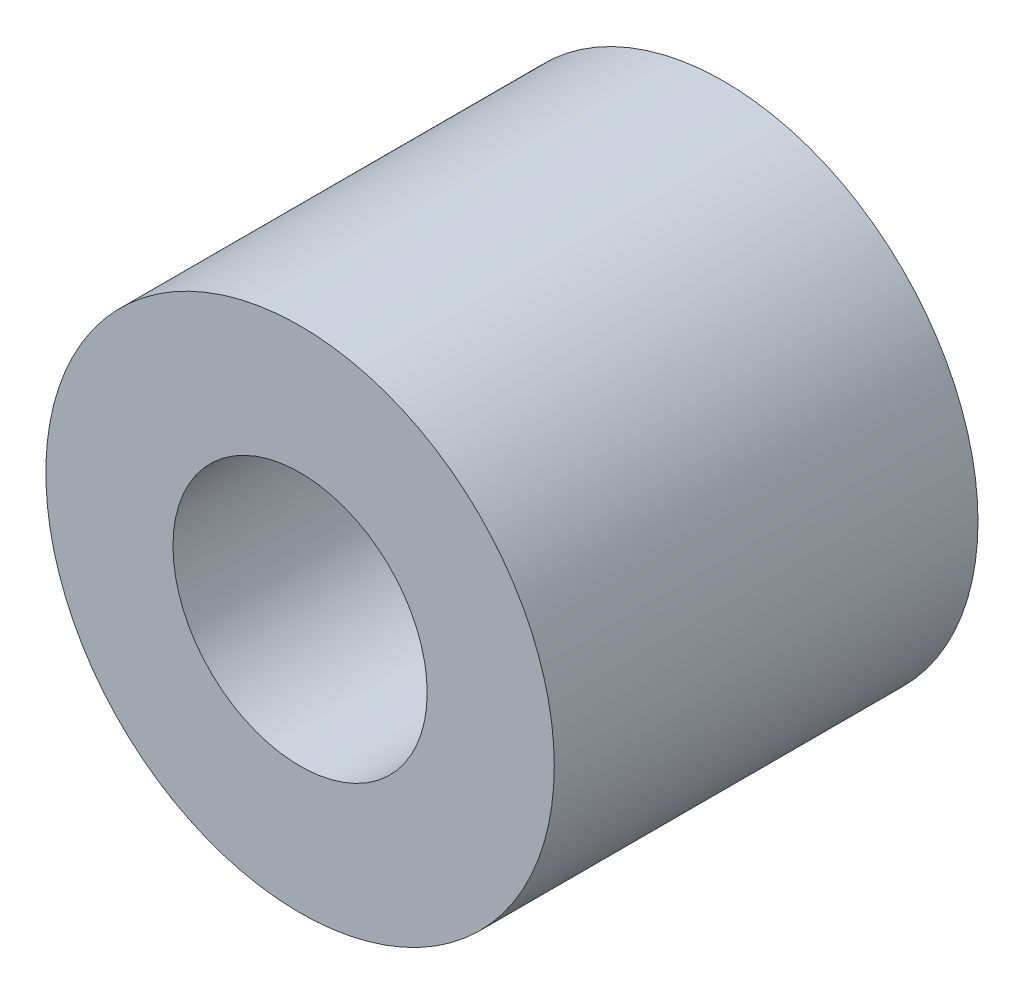
ISO-10303-21;
HEADER;
FILE_DESCRIPTION(('STEP AP214'),'2;1');
FILE_NAME('part.step','',(''),(''),'','','');
FILE_SCHEMA(('AUTOMOTIVE_DESIGN { 1 0 10303 214 1 1 1 1 }'));
ENDSEC;
DATA;
#1=APPLICATION_CONTEXT('core data for automotive mechanical design processes');
#2=APPLICATION_PROTOCOL_DEFINITION('international standard','automotive_design',2000,#1);
#3=PRODUCT_CONTEXT('',#1,'mechanical');
#4=PRODUCT('Part','Part','',(#3));
#5=PRODUCT_RELATED_PRODUCT_CATEGORY('part','',(#4));
#6=PRODUCT_DEFINITION_FORMATION('','',#4);
#7=PRODUCT_DEFINITION_CONTEXT('part definition',#1,'design');
#8=PRODUCT_DEFINITION('design','',#6,#7);
#9=PRODUCT_DEFINITION_SHAPE('','',#8);
#10=(LENGTH_UNIT() NAMED_UNIT(*) SI_UNIT(.MILLI.,.METRE.));
#11=(NAMED_UNIT(*) PLANE_ANGLE_UNIT() SI_UNIT($,.RADIAN.));
#12=(NAMED_UNIT(*) SI_UNIT($,.STERADIAN.) SOLID_ANGLE_UNIT());
#13=UNCERTAINTY_MEASURE_WITH_UNIT(LENGTH_MEASURE(1.E-05),#10,'distance_accuracy_value','');
#14=(GEOMETRIC_REPRESENTATION_CONTEXT(3) GLOBAL_UNCERTAINTY_ASSIGNED_CONTEXT((#13)) GLOBAL_UNIT_ASSIGNED_CONTEXT((#10,
#11,#12)) REPRESENTATION_CONTEXT('',''));
#15=CARTESIAN_POINT('',(0.,0.,0.));
#16=DIRECTION('',(0.,0.,1.));
#17=DIRECTION('',(1.,0.,0.));
#18=AXIS2_PLACEMENT_3D('',#15,#16,#17);
#19=CARTESIAN_POINT('',(0.,0.,5.));
#20=DIRECTION('',(0.,0.,1.));
#21=DIRECTION('',(1.,0.,0.));
#22=AXIS2_PLACEMENT_3D('',#19,#20,#21);
#23=PLANE('',#22);
#24=CARTESIAN_POINT('',(0.,0.,5.));
#25=DIRECTION('',(0.,0.,1.));
#26=DIRECTION('',(1.,0.,0.));
#27=AXIS2_PLACEMENT_3D('',#24,#25,#26);
#28=CIRCLE('',#27,3.);
#29=CARTESIAN_POINT('',(3.,0.,5.));
#30=VERTEX_POINT('',#29);
#31=EDGE_CURVE('E10',#30,#30,#28,.T.);
#32=ORIENTED_EDGE('',*,*,#31,.T.);
#33=EDGE_LOOP('',(#32));
#34=FACE_BOUND('',#33,.T.);
#35=CARTESIAN_POINT('',(0.,0.,5.));
#36=DIRECTION('',(0.,0.,1.));
#37=DIRECTION('',(1.,0.,0.));
#38=AXIS2_PLACEMENT_3D('',#35,#36,#37);
#39=CIRCLE('',#38,1.5);
#40=CARTESIAN_POINT('',(1.5,0.,5.));
#41=VERTEX_POINT('',#40);
#42=EDGE_CURVE('E43',#41,#41,#39,.T.);
#43=ORIENTED_EDGE('',*,*,#42,.F.);
#44=EDGE_LOOP('',(#43));
#45=FACE_BOUND('',#44,.T.);
#46=ADVANCED_FACE('F32',(#34,#45),#23,.T.);
#47=CARTESIAN_POINT('',(0.,0.,0.));
#48=DIRECTION('',(0.,0.,1.));
#49=DIRECTION('',(1.,0.,0.));
#50=AXIS2_PLACEMENT_3D('',#47,#48,#49);
#51=PLANE('',#50);
#52=CARTESIAN_POINT('',(0.,0.,0.));
#53=DIRECTION('',(0.,0.,1.));
#54=DIRECTION('',(1.,0.,0.));
#55=AXIS2_PLACEMENT_3D('',#52,#53,#54);
#56=CIRCLE('',#55,3.);
#57=CARTESIAN_POINT('',(3.,0.,0.));
#58=VERTEX_POINT('',#57);
#59=EDGE_CURVE('E36',#58,#58,#56,.T.);
#60=ORIENTED_EDGE('',*,*,#59,.F.);
#61=EDGE_LOOP('',(#60));
#62=FACE_BOUND('',#61,.T.);
#63=CARTESIAN_POINT('',(0.,0.,0.));
#64=DIRECTION('',(0.,0.,1.));
#65=DIRECTION('',(1.,0.,0.));
#66=AXIS2_PLACEMENT_3D('',#63,#64,#65);
#67=CIRCLE('',#66,1.5);
#68=CARTESIAN_POINT('',(1.5,0.,0.));
#69=VERTEX_POINT('',#68);
#70=EDGE_CURVE('E45',#69,#69,#67,.T.);
#71=ORIENTED_EDGE('',*,*,#70,.T.);
#72=EDGE_LOOP('',(#71));
#73=FACE_BOUND('',#72,.T.);
#74=ADVANCED_FACE('F55',(#62,#73),#51,.F.);
#75=CARTESIAN_POINT('',(0.,0.,5.));
#76=DIRECTION('',(0.,0.,-1.));
#77=DIRECTION('',(-1.,0.,0.));
#78=AXIS2_PLACEMENT_3D('',#75,#76,#77);
#79=CYLINDRICAL_SURFACE('',#78,3.);
#80=ORIENTED_EDGE('',*,*,#31,.F.);
#81=EDGE_LOOP('',(#80));
#82=FACE_BOUND('',#81,.T.);
#83=ORIENTED_EDGE('',*,*,#59,.T.);
#84=EDGE_LOOP('',(#83));
#85=FACE_BOUND('',#84,.T.);
#86=ADVANCED_FACE('F34',(#82,#85),#79,.T.);
#87=CARTESIAN_POINT('',(0.,0.,5.));
#88=DIRECTION('',(0.,0.,-1.));
#89=DIRECTION('',(-1.,0.,0.));
#90=AXIS2_PLACEMENT_3D('',#87,#88,#89);
#91=CYLINDRICAL_SURFACE('',#90,1.5);
#92=ORIENTED_EDGE('',*,*,#42,.T.);
#93=EDGE_LOOP('',(#92));
#94=FACE_BOUND('',#93,.T.);
#95=ORIENTED_EDGE('',*,*,#70,.F.);
#96=EDGE_LOOP('',(#95));
#97=FACE_BOUND('',#96,.T.);
#98=ADVANCED_FACE('F51',(#94,#97),#91,.F.);
#99=CLOSED_SHELL('',(#46,#74,#86,#98));
#100=MANIFOLD_SOLID_BREP('B2',#99);
#101=ADVANCED_BREP_SHAPE_REPRESENTATION('',(#18,#100),#14);
#102=SHAPE_DEFINITION_REPRESENTATION(#9,#101);
ENDSEC;
END-ISO-10303-21;
